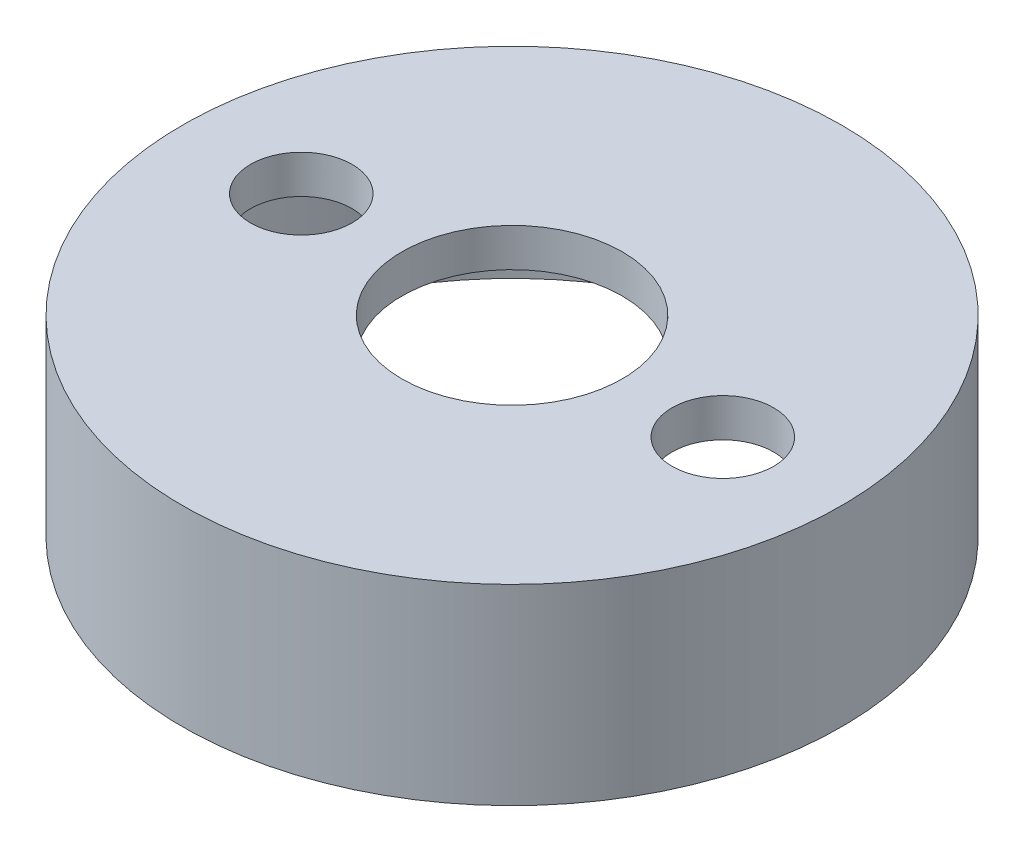
ISO-10303-21;
HEADER;
FILE_DESCRIPTION(('STEP AP214'),'2;1');
FILE_NAME('part.step','',(''),(''),'','','');
FILE_SCHEMA(('AUTOMOTIVE_DESIGN { 1 0 10303 214 1 1 1 1 }'));
ENDSEC;
DATA;
#1=APPLICATION_CONTEXT('core data for automotive mechanical design processes');
#2=APPLICATION_PROTOCOL_DEFINITION('international standard','automotive_design',2000,#1);
#3=PRODUCT_CONTEXT('',#1,'mechanical');
#4=PRODUCT('Part','Part','',(#3));
#5=PRODUCT_RELATED_PRODUCT_CATEGORY('part','',(#4));
#6=PRODUCT_DEFINITION_FORMATION('','',#4);
#7=PRODUCT_DEFINITION_CONTEXT('part definition',#1,'design');
#8=PRODUCT_DEFINITION('design','',#6,#7);
#9=PRODUCT_DEFINITION_SHAPE('','',#8);
#10=(LENGTH_UNIT() NAMED_UNIT(*) SI_UNIT(.MILLI.,.METRE.));
#11=(NAMED_UNIT(*) PLANE_ANGLE_UNIT() SI_UNIT($,.RADIAN.));
#12=(NAMED_UNIT(*) SI_UNIT($,.STERADIAN.) SOLID_ANGLE_UNIT());
#13=UNCERTAINTY_MEASURE_WITH_UNIT(LENGTH_MEASURE(1.E-05),#10,'distance_accuracy_value','');
#14=(GEOMETRIC_REPRESENTATION_CONTEXT(3) GLOBAL_UNCERTAINTY_ASSIGNED_CONTEXT((#13)) GLOBAL_UNIT_ASSIGNED_CONTEXT((#10,
#11,#12)) REPRESENTATION_CONTEXT('',''));
#15=CARTESIAN_POINT('',(0.,0.,0.));
#16=DIRECTION('',(0.,0.,1.));
#17=DIRECTION('',(1.,0.,0.));
#18=AXIS2_PLACEMENT_3D('',#15,#16,#17);
#19=CARTESIAN_POINT('',(0.,-9.26010101010103,0.));
#20=DIRECTION('',(0.,-1.,0.));
#21=DIRECTION('',(0.,0.,-1.));
#22=AXIS2_PLACEMENT_3D('',#19,#20,#21);
#23=CYLINDRICAL_SURFACE('',#22,17.2);
#24=CARTESIAN_POINT('',(0.,10.,0.));
#25=DIRECTION('',(0.,-1.,0.));
#26=DIRECTION('',(0.,0.,-1.));
#27=AXIS2_PLACEMENT_3D('',#24,#25,#26);
#28=CIRCLE('',#27,17.2);
#29=CARTESIAN_POINT('',(0.,10.,-17.2));
#30=VERTEX_POINT('',#29);
#31=EDGE_CURVE('E54',#30,#30,#28,.T.);
#32=ORIENTED_EDGE('',*,*,#31,.T.);
#33=EDGE_LOOP('',(#32));
#34=FACE_BOUND('',#33,.T.);
#35=CARTESIAN_POINT('',(0.,0.,0.));
#36=DIRECTION('',(0.,-1.,0.));
#37=DIRECTION('',(0.,0.,-1.));
#38=AXIS2_PLACEMENT_3D('',#35,#36,#37);
#39=CIRCLE('',#38,17.2);
#40=CARTESIAN_POINT('',(0.,0.,-17.2));
#41=VERTEX_POINT('',#40);
#42=EDGE_CURVE('E10',#41,#41,#39,.T.);
#43=ORIENTED_EDGE('',*,*,#42,.F.);
#44=EDGE_LOOP('',(#43));
#45=FACE_BOUND('',#44,.T.);
#46=ADVANCED_FACE('F33',(#34,#45),#23,.T.);
#47=CARTESIAN_POINT('',(17.2,0.,0.));
#48=DIRECTION('',(0.,-1.,0.));
#49=DIRECTION('',(0.,0.,-1.));
#50=AXIS2_PLACEMENT_3D('',#47,#48,#49);
#51=PLANE('',#50);
#52=ORIENTED_EDGE('',*,*,#42,.T.);
#53=EDGE_LOOP('',(#52));
#54=FACE_BOUND('',#53,.T.);
#55=CARTESIAN_POINT('',(0.,0.,0.));
#56=DIRECTION('',(0.,-1.,0.));
#57=DIRECTION('',(0.,0.,-1.));
#58=AXIS2_PLACEMENT_3D('',#55,#56,#57);
#59=CIRCLE('',#58,16.5);
#60=CARTESIAN_POINT('',(0.,0.,-16.5));
#61=VERTEX_POINT('',#60);
#62=EDGE_CURVE('E40',#61,#61,#59,.T.);
#63=ORIENTED_EDGE('',*,*,#62,.F.);
#64=EDGE_LOOP('',(#63));
#65=FACE_BOUND('',#64,.T.);
#66=ADVANCED_FACE('F78',(#54,#65),#51,.T.);
#67=CARTESIAN_POINT('',(0.,-9.26010101010103,0.));
#68=DIRECTION('',(0.,-1.,0.));
#69=DIRECTION('',(0.,0.,-1.));
#70=AXIS2_PLACEMENT_3D('',#67,#68,#69);
#71=CYLINDRICAL_SURFACE('',#70,16.5);
#72=ORIENTED_EDGE('',*,*,#62,.T.);
#73=EDGE_LOOP('',(#72));
#74=FACE_BOUND('',#73,.T.);
#75=CARTESIAN_POINT('',(0.,8.,0.));
#76=DIRECTION('',(0.,-1.,0.));
#77=DIRECTION('',(0.,0.,-1.));
#78=AXIS2_PLACEMENT_3D('',#75,#76,#77);
#79=CIRCLE('',#78,16.5);
#80=CARTESIAN_POINT('',(0.,8.,-16.5));
#81=VERTEX_POINT('',#80);
#82=EDGE_CURVE('E45',#81,#81,#79,.T.);
#83=ORIENTED_EDGE('',*,*,#82,.F.);
#84=EDGE_LOOP('',(#83));
#85=FACE_BOUND('',#84,.T.);
#86=ADVANCED_FACE('F76',(#74,#85),#71,.F.);
#87=CARTESIAN_POINT('',(16.5,8.,0.));
#88=DIRECTION('',(0.,-1.,0.));
#89=DIRECTION('',(0.,0.,-1.));
#90=AXIS2_PLACEMENT_3D('',#87,#88,#89);
#91=PLANE('',#90);
#92=CARTESIAN_POINT('',(-11.,8.,0.));
#93=DIRECTION('',(0.,-1.,0.));
#94=DIRECTION('',(0.,0.,-1.));
#95=AXIS2_PLACEMENT_3D('',#92,#93,#94);
#96=CIRCLE('',#95,2.65);
#97=CARTESIAN_POINT('',(-11.,8.,-2.65));
#98=VERTEX_POINT('',#97);
#99=EDGE_CURVE('E50',#98,#98,#96,.T.);
#100=ORIENTED_EDGE('',*,*,#99,.F.);
#101=EDGE_LOOP('',(#100));
#102=FACE_BOUND('',#101,.T.);
#103=CARTESIAN_POINT('',(11.,8.,0.));
#104=DIRECTION('',(0.,-1.,0.));
#105=DIRECTION('',(0.,0.,-1.));
#106=AXIS2_PLACEMENT_3D('',#103,#104,#105);
#107=CIRCLE('',#106,2.65);
#108=CARTESIAN_POINT('',(11.,8.,-2.65));
#109=VERTEX_POINT('',#108);
#110=EDGE_CURVE('E56',#109,#109,#107,.T.);
#111=ORIENTED_EDGE('',*,*,#110,.F.);
#112=EDGE_LOOP('',(#111));
#113=FACE_BOUND('',#112,.T.);
#114=ORIENTED_EDGE('',*,*,#82,.T.);
#115=EDGE_LOOP('',(#114));
#116=FACE_BOUND('',#115,.T.);
#117=CARTESIAN_POINT('',(0.,8.,0.));
#118=DIRECTION('',(0.,-1.,0.));
#119=DIRECTION('',(0.,0.,-1.));
#120=AXIS2_PLACEMENT_3D('',#117,#118,#119);
#121=CIRCLE('',#120,5.75);
#122=CARTESIAN_POINT('',(0.,8.,-5.75));
#123=VERTEX_POINT('',#122);
#124=EDGE_CURVE('E68',#123,#123,#121,.T.);
#125=ORIENTED_EDGE('',*,*,#124,.F.);
#126=EDGE_LOOP('',(#125));
#127=FACE_BOUND('',#126,.T.);
#128=ADVANCED_FACE('F73',(#102,#113,#116,#127),#91,.T.);
#129=CARTESIAN_POINT('',(0.,-9.26010101010103,0.));
#130=DIRECTION('',(0.,-1.,0.));
#131=DIRECTION('',(0.,0.,-1.));
#132=AXIS2_PLACEMENT_3D('',#129,#130,#131);
#133=CYLINDRICAL_SURFACE('',#132,5.75);
#134=ORIENTED_EDGE('',*,*,#124,.T.);
#135=EDGE_LOOP('',(#134));
#136=FACE_BOUND('',#135,.T.);
#137=CARTESIAN_POINT('',(0.,10.,0.));
#138=DIRECTION('',(0.,-1.,0.));
#139=DIRECTION('',(0.,0.,-1.));
#140=AXIS2_PLACEMENT_3D('',#137,#138,#139);
#141=CIRCLE('',#140,5.75);
#142=CARTESIAN_POINT('',(0.,10.,-5.75));
#143=VERTEX_POINT('',#142);
#144=EDGE_CURVE('E65',#143,#143,#141,.T.);
#145=ORIENTED_EDGE('',*,*,#144,.F.);
#146=EDGE_LOOP('',(#145));
#147=FACE_BOUND('',#146,.T.);
#148=ADVANCED_FACE('F85',(#136,#147),#133,.F.);
#149=CARTESIAN_POINT('',(5.75,10.,0.));
#150=DIRECTION('',(0.,1.,0.));
#151=DIRECTION('',(0.,0.,1.));
#152=AXIS2_PLACEMENT_3D('',#149,#150,#151);
#153=PLANE('',#152);
#154=CARTESIAN_POINT('',(-11.,10.,0.));
#155=DIRECTION('',(0.,1.,0.));
#156=DIRECTION('',(0.,0.,1.));
#157=AXIS2_PLACEMENT_3D('',#154,#155,#156);
#158=CIRCLE('',#157,2.65);
#159=CARTESIAN_POINT('',(-11.,10.,2.65));
#160=VERTEX_POINT('',#159);
#161=EDGE_CURVE('E36',#160,#160,#158,.T.);
#162=ORIENTED_EDGE('',*,*,#161,.F.);
#163=EDGE_LOOP('',(#162));
#164=FACE_BOUND('',#163,.T.);
#165=CARTESIAN_POINT('',(11.,10.,0.));
#166=DIRECTION('',(0.,1.,0.));
#167=DIRECTION('',(0.,0.,1.));
#168=AXIS2_PLACEMENT_3D('',#165,#166,#167);
#169=CIRCLE('',#168,2.65);
#170=CARTESIAN_POINT('',(11.,10.,2.65));
#171=VERTEX_POINT('',#170);
#172=EDGE_CURVE('E48',#171,#171,#169,.T.);
#173=ORIENTED_EDGE('',*,*,#172,.F.);
#174=EDGE_LOOP('',(#173));
#175=FACE_BOUND('',#174,.T.);
#176=ORIENTED_EDGE('',*,*,#144,.T.);
#177=EDGE_LOOP('',(#176));
#178=FACE_BOUND('',#177,.T.);
#179=ORIENTED_EDGE('',*,*,#31,.F.);
#180=EDGE_LOOP('',(#179));
#181=FACE_BOUND('',#180,.T.);
#182=ADVANCED_FACE('F95',(#164,#175,#178,#181),#153,.T.);
#183=CARTESIAN_POINT('',(11.,18.,0.));
#184=DIRECTION('',(0.,-1.,0.));
#185=DIRECTION('',(0.,0.,-1.));
#186=AXIS2_PLACEMENT_3D('',#183,#184,#185);
#187=CYLINDRICAL_SURFACE('',#186,2.65);
#188=ORIENTED_EDGE('',*,*,#172,.T.);
#189=EDGE_LOOP('',(#188));
#190=FACE_BOUND('',#189,.T.);
#191=ORIENTED_EDGE('',*,*,#110,.T.);
#192=EDGE_LOOP('',(#191));
#193=FACE_BOUND('',#192,.T.);
#194=ADVANCED_FACE('F97',(#190,#193),#187,.F.);
#195=CARTESIAN_POINT('',(-11.,18.,0.));
#196=DIRECTION('',(0.,-1.,0.));
#197=DIRECTION('',(0.,0.,-1.));
#198=AXIS2_PLACEMENT_3D('',#195,#196,#197);
#199=CYLINDRICAL_SURFACE('',#198,2.65);
#200=ORIENTED_EDGE('',*,*,#161,.T.);
#201=EDGE_LOOP('',(#200));
#202=FACE_BOUND('',#201,.T.);
#203=ORIENTED_EDGE('',*,*,#99,.T.);
#204=EDGE_LOOP('',(#203));
#205=FACE_BOUND('',#204,.T.);
#206=ADVANCED_FACE('F104',(#202,#205),#199,.F.);
#207=CLOSED_SHELL('',(#46,#66,#86,#128,#148,#182,#194,#206));
#208=MANIFOLD_SOLID_BREP('B2',#207);
#209=ADVANCED_BREP_SHAPE_REPRESENTATION('',(#18,#208),#14);
#210=SHAPE_DEFINITION_REPRESENTATION(#9,#209);
ENDSEC;
END-ISO-10303-21;
